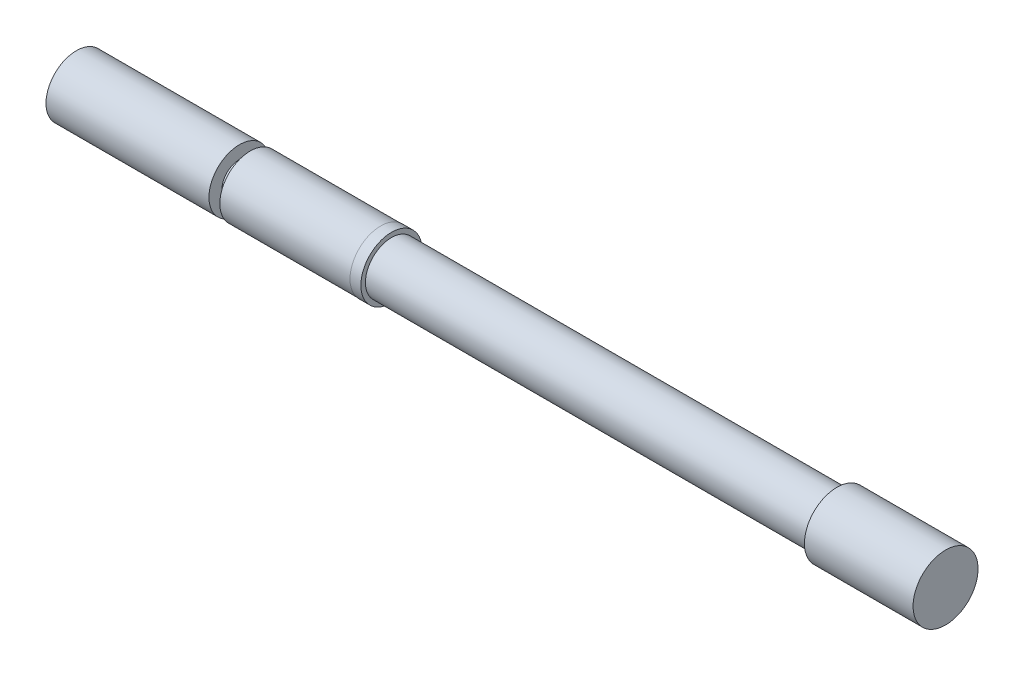
ISO-10303-21;
HEADER;
FILE_DESCRIPTION(('STEP AP214'),'2;1');
FILE_NAME('part.step','',(''),(''),'','','');
FILE_SCHEMA(('AUTOMOTIVE_DESIGN { 1 0 10303 214 1 1 1 1 }'));
ENDSEC;
DATA;
#1=APPLICATION_CONTEXT('core data for automotive mechanical design processes');
#2=APPLICATION_PROTOCOL_DEFINITION('international standard','automotive_design',2000,#1);
#3=PRODUCT_CONTEXT('',#1,'mechanical');
#4=PRODUCT('Part','Part','',(#3));
#5=PRODUCT_RELATED_PRODUCT_CATEGORY('part','',(#4));
#6=PRODUCT_DEFINITION_FORMATION('','',#4);
#7=PRODUCT_DEFINITION_CONTEXT('part definition',#1,'design');
#8=PRODUCT_DEFINITION('design','',#6,#7);
#9=PRODUCT_DEFINITION_SHAPE('','',#8);
#10=(LENGTH_UNIT() NAMED_UNIT(*) SI_UNIT(.MILLI.,.METRE.));
#11=(NAMED_UNIT(*) PLANE_ANGLE_UNIT() SI_UNIT($,.RADIAN.));
#12=(NAMED_UNIT(*) SI_UNIT($,.STERADIAN.) SOLID_ANGLE_UNIT());
#13=UNCERTAINTY_MEASURE_WITH_UNIT(LENGTH_MEASURE(1.E-05),#10,'distance_accuracy_value','');
#14=(GEOMETRIC_REPRESENTATION_CONTEXT(3) GLOBAL_UNCERTAINTY_ASSIGNED_CONTEXT((#13)) GLOBAL_UNIT_ASSIGNED_CONTEXT((#10,
#11,#12)) REPRESENTATION_CONTEXT('',''));
#15=CARTESIAN_POINT('',(0.,0.,0.));
#16=DIRECTION('',(0.,0.,1.));
#17=DIRECTION('',(1.,0.,0.));
#18=AXIS2_PLACEMENT_3D('',#15,#16,#17);
#19=CARTESIAN_POINT('',(0.,0.,0.));
#20=DIRECTION('',(1.,0.,0.));
#21=DIRECTION('',(0.,0.,-1.));
#22=AXIS2_PLACEMENT_3D('',#19,#20,#21);
#23=PLANE('',#22);
#24=CARTESIAN_POINT('',(0.,0.,0.));
#25=DIRECTION('',(-1.,0.,0.));
#26=DIRECTION('',(0.,0.,1.));
#27=AXIS2_PLACEMENT_3D('',#24,#25,#26);
#28=CIRCLE('',#27,14.);
#29=CARTESIAN_POINT('',(0.,0.,14.));
#30=VERTEX_POINT('',#29);
#31=EDGE_CURVE('E10',#30,#30,#28,.T.);
#32=ORIENTED_EDGE('',*,*,#31,.T.);
#33=EDGE_LOOP('',(#32));
#34=FACE_BOUND('',#33,.T.);
#35=ADVANCED_FACE('F37',(#34),#23,.F.);
#36=CARTESIAN_POINT('',(0.,0.,0.));
#37=DIRECTION('',(-1.,0.,0.));
#38=DIRECTION('',(0.,0.,1.));
#39=AXIS2_PLACEMENT_3D('',#36,#37,#38);
#40=CYLINDRICAL_SURFACE('',#39,14.);
#41=ORIENTED_EDGE('',*,*,#31,.F.);
#42=EDGE_LOOP('',(#41));
#43=FACE_BOUND('',#42,.T.);
#44=CARTESIAN_POINT('',(75.,0.,0.));
#45=DIRECTION('',(-1.,0.,0.));
#46=DIRECTION('',(0.,0.,1.));
#47=AXIS2_PLACEMENT_3D('',#44,#45,#46);
#48=CIRCLE('',#47,14.);
#49=CARTESIAN_POINT('',(75.,0.,14.));
#50=VERTEX_POINT('',#49);
#51=EDGE_CURVE('E44',#50,#50,#48,.T.);
#52=ORIENTED_EDGE('',*,*,#51,.T.);
#53=EDGE_LOOP('',(#52));
#54=FACE_BOUND('',#53,.T.);
#55=ADVANCED_FACE('F105',(#43,#54),#40,.T.);
#56=CARTESIAN_POINT('',(75.,14.,0.));
#57=DIRECTION('',(-1.,0.,0.));
#58=DIRECTION('',(0.,0.,1.));
#59=AXIS2_PLACEMENT_3D('',#56,#57,#58);
#60=PLANE('',#59);
#61=ORIENTED_EDGE('',*,*,#51,.F.);
#62=EDGE_LOOP('',(#61));
#63=FACE_BOUND('',#62,.T.);
#64=CARTESIAN_POINT('',(75.,0.,0.));
#65=DIRECTION('',(-1.,0.,0.));
#66=DIRECTION('',(0.,0.,1.));
#67=AXIS2_PLACEMENT_3D('',#64,#65,#66);
#68=CIRCLE('',#67,8.08666508621472);
#69=CARTESIAN_POINT('',(75.,0.,8.08666508621472));
#70=VERTEX_POINT('',#69);
#71=EDGE_CURVE('E49',#70,#70,#68,.T.);
#72=ORIENTED_EDGE('',*,*,#71,.T.);
#73=EDGE_LOOP('',(#72));
#74=FACE_BOUND('',#73,.T.);
#75=ADVANCED_FACE('F109',(#63,#74),#60,.F.);
#76=CARTESIAN_POINT('',(0.,0.,0.));
#77=DIRECTION('',(-1.,0.,0.));
#78=DIRECTION('',(0.,0.,1.));
#79=AXIS2_PLACEMENT_3D('',#76,#77,#78);
#80=CYLINDRICAL_SURFACE('',#79,8.08666508621472);
#81=ORIENTED_EDGE('',*,*,#71,.F.);
#82=EDGE_LOOP('',(#81));
#83=FACE_BOUND('',#82,.T.);
#84=CARTESIAN_POINT('',(80.,0.,0.));
#85=DIRECTION('',(-1.,0.,0.));
#86=DIRECTION('',(0.,0.,1.));
#87=AXIS2_PLACEMENT_3D('',#84,#85,#86);
#88=CIRCLE('',#87,8.08666508621472);
#89=CARTESIAN_POINT('',(80.,0.,8.08666508621472));
#90=VERTEX_POINT('',#89);
#91=EDGE_CURVE('E54',#90,#90,#88,.T.);
#92=ORIENTED_EDGE('',*,*,#91,.T.);
#93=EDGE_LOOP('',(#92));
#94=FACE_BOUND('',#93,.T.);
#95=ADVANCED_FACE('F114',(#83,#94),#80,.T.);
#96=CARTESIAN_POINT('',(80.,8.08666508621472,0.));
#97=DIRECTION('',(1.,0.,0.));
#98=DIRECTION('',(0.,0.,-1.));
#99=AXIS2_PLACEMENT_3D('',#96,#97,#98);
#100=PLANE('',#99);
#101=ORIENTED_EDGE('',*,*,#91,.F.);
#102=EDGE_LOOP('',(#101));
#103=FACE_BOUND('',#102,.T.);
#104=CARTESIAN_POINT('',(80.,0.,0.));
#105=DIRECTION('',(-1.,0.,0.));
#106=DIRECTION('',(0.,0.,1.));
#107=AXIS2_PLACEMENT_3D('',#104,#105,#106);
#108=CIRCLE('',#107,14.);
#109=CARTESIAN_POINT('',(80.,0.,14.));
#110=VERTEX_POINT('',#109);
#111=EDGE_CURVE('E60',#110,#110,#108,.T.);
#112=ORIENTED_EDGE('',*,*,#111,.T.);
#113=EDGE_LOOP('',(#112));
#114=FACE_BOUND('',#113,.T.);
#115=ADVANCED_FACE('F120',(#103,#114),#100,.F.);
#116=CARTESIAN_POINT('',(0.,0.,0.));
#117=DIRECTION('',(-1.,0.,0.));
#118=DIRECTION('',(0.,0.,1.));
#119=AXIS2_PLACEMENT_3D('',#116,#117,#118);
#120=CYLINDRICAL_SURFACE('',#119,14.);
#121=ORIENTED_EDGE('',*,*,#111,.F.);
#122=EDGE_LOOP('',(#121));
#123=FACE_BOUND('',#122,.T.);
#124=CARTESIAN_POINT('',(140.,0.,0.));
#125=DIRECTION('',(-1.,0.,0.));
#126=DIRECTION('',(0.,0.,1.));
#127=AXIS2_PLACEMENT_3D('',#124,#125,#126);
#128=CIRCLE('',#127,14.);
#129=CARTESIAN_POINT('',(140.,0.,14.));
#130=VERTEX_POINT('',#129);
#131=EDGE_CURVE('E64',#130,#130,#128,.T.);
#132=ORIENTED_EDGE('',*,*,#131,.T.);
#133=EDGE_LOOP('',(#132));
#134=FACE_BOUND('',#133,.T.);
#135=ADVANCED_FACE('F124',(#123,#134),#120,.T.);
#136=CARTESIAN_POINT('',(140.,14.,0.));
#137=DIRECTION('',(1.,0.,0.));
#138=DIRECTION('',(0.,0.,-1.));
#139=AXIS2_PLACEMENT_3D('',#136,#137,#138);
#140=PLANE('',#139);
#141=ORIENTED_EDGE('',*,*,#131,.F.);
#142=EDGE_LOOP('',(#141));
#143=FACE_BOUND('',#142,.T.);
#144=CARTESIAN_POINT('',(140.,0.,0.));
#145=DIRECTION('',(-1.,0.,0.));
#146=DIRECTION('',(0.,0.,1.));
#147=AXIS2_PLACEMENT_3D('',#144,#145,#146);
#148=CIRCLE('',#147,14.094661294728);
#149=CARTESIAN_POINT('',(140.,0.,14.094661294728));
#150=VERTEX_POINT('',#149);
#151=EDGE_CURVE('E68',#150,#150,#148,.T.);
#152=ORIENTED_EDGE('',*,*,#151,.T.);
#153=EDGE_LOOP('',(#152));
#154=FACE_BOUND('',#153,.T.);
#155=ADVANCED_FACE('F128',(#143,#154),#140,.F.);
#156=CARTESIAN_POINT('',(0.,0.,0.));
#157=DIRECTION('',(-1.,0.,0.));
#158=DIRECTION('',(0.,0.,1.));
#159=AXIS2_PLACEMENT_3D('',#156,#157,#158);
#160=CYLINDRICAL_SURFACE('',#159,14.094661294728);
#161=ORIENTED_EDGE('',*,*,#151,.F.);
#162=EDGE_LOOP('',(#161));
#163=FACE_BOUND('',#162,.T.);
#164=CARTESIAN_POINT('',(145.,0.,0.));
#165=DIRECTION('',(-1.,0.,0.));
#166=DIRECTION('',(0.,0.,1.));
#167=AXIS2_PLACEMENT_3D('',#164,#165,#166);
#168=CIRCLE('',#167,14.094661294728);
#169=CARTESIAN_POINT('',(145.,0.,14.094661294728));
#170=VERTEX_POINT('',#169);
#171=EDGE_CURVE('E72',#170,#170,#168,.T.);
#172=ORIENTED_EDGE('',*,*,#171,.T.);
#173=EDGE_LOOP('',(#172));
#174=FACE_BOUND('',#173,.T.);
#175=ADVANCED_FACE('F132',(#163,#174),#160,.T.);
#176=CARTESIAN_POINT('',(145.,14.094661294728,0.));
#177=DIRECTION('',(-1.,0.,0.));
#178=DIRECTION('',(0.,0.,1.));
#179=AXIS2_PLACEMENT_3D('',#176,#177,#178);
#180=PLANE('',#179);
#181=ORIENTED_EDGE('',*,*,#171,.F.);
#182=EDGE_LOOP('',(#181));
#183=FACE_BOUND('',#182,.T.);
#184=CARTESIAN_POINT('',(145.,0.,0.));
#185=DIRECTION('',(-1.,0.,0.));
#186=DIRECTION('',(0.,0.,1.));
#187=AXIS2_PLACEMENT_3D('',#184,#185,#186);
#188=CIRCLE('',#187,12.);
#189=CARTESIAN_POINT('',(145.,0.,12.));
#190=VERTEX_POINT('',#189);
#191=EDGE_CURVE('E76',#190,#190,#188,.T.);
#192=ORIENTED_EDGE('',*,*,#191,.T.);
#193=EDGE_LOOP('',(#192));
#194=FACE_BOUND('',#193,.T.);
#195=ADVANCED_FACE('F136',(#183,#194),#180,.F.);
#196=CARTESIAN_POINT('',(0.,0.,0.));
#197=DIRECTION('',(-1.,0.,0.));
#198=DIRECTION('',(0.,0.,1.));
#199=AXIS2_PLACEMENT_3D('',#196,#197,#198);
#200=CYLINDRICAL_SURFACE('',#199,12.);
#201=ORIENTED_EDGE('',*,*,#191,.F.);
#202=EDGE_LOOP('',(#201));
#203=FACE_BOUND('',#202,.T.);
#204=CARTESIAN_POINT('',(350.,0.,0.));
#205=DIRECTION('',(-1.,0.,0.));
#206=DIRECTION('',(0.,0.,1.));
#207=AXIS2_PLACEMENT_3D('',#204,#205,#206);
#208=CIRCLE('',#207,12.);
#209=CARTESIAN_POINT('',(350.,0.,12.));
#210=VERTEX_POINT('',#209);
#211=EDGE_CURVE('E80',#210,#210,#208,.T.);
#212=ORIENTED_EDGE('',*,*,#211,.T.);
#213=EDGE_LOOP('',(#212));
#214=FACE_BOUND('',#213,.T.);
#215=ADVANCED_FACE('F140',(#203,#214),#200,.T.);
#216=CARTESIAN_POINT('',(350.,12.,0.));
#217=DIRECTION('',(1.,0.,0.));
#218=DIRECTION('',(0.,0.,-1.));
#219=AXIS2_PLACEMENT_3D('',#216,#217,#218);
#220=PLANE('',#219);
#221=ORIENTED_EDGE('',*,*,#211,.F.);
#222=EDGE_LOOP('',(#221));
#223=FACE_BOUND('',#222,.T.);
#224=CARTESIAN_POINT('',(350.,0.,0.));
#225=DIRECTION('',(-1.,0.,0.));
#226=DIRECTION('',(0.,0.,1.));
#227=AXIS2_PLACEMENT_3D('',#224,#225,#226);
#228=CIRCLE('',#227,14.9566674568927);
#229=CARTESIAN_POINT('',(350.,0.,14.9566674568927));
#230=VERTEX_POINT('',#229);
#231=EDGE_CURVE('E84',#230,#230,#228,.T.);
#232=ORIENTED_EDGE('',*,*,#231,.T.);
#233=EDGE_LOOP('',(#232));
#234=FACE_BOUND('',#233,.T.);
#235=ADVANCED_FACE('F101',(#223,#234),#220,.F.);
#236=CARTESIAN_POINT('',(0.,0.,0.));
#237=DIRECTION('',(-1.,0.,0.));
#238=DIRECTION('',(0.,0.,1.));
#239=AXIS2_PLACEMENT_3D('',#236,#237,#238);
#240=CYLINDRICAL_SURFACE('',#239,14.9566674568927);
#241=ORIENTED_EDGE('',*,*,#231,.F.);
#242=EDGE_LOOP('',(#241));
#243=FACE_BOUND('',#242,.T.);
#244=CARTESIAN_POINT('',(400.,0.,0.));
#245=DIRECTION('',(-1.,0.,0.));
#246=DIRECTION('',(0.,0.,1.));
#247=AXIS2_PLACEMENT_3D('',#244,#245,#246);
#248=CIRCLE('',#247,14.9566674568926);
#249=CARTESIAN_POINT('',(400.,0.,14.9566674568926));
#250=VERTEX_POINT('',#249);
#251=EDGE_CURVE('E88',#250,#250,#248,.T.);
#252=ORIENTED_EDGE('',*,*,#251,.T.);
#253=EDGE_LOOP('',(#252));
#254=FACE_BOUND('',#253,.T.);
#255=ADVANCED_FACE('F93',(#243,#254),#240,.T.);
#256=CARTESIAN_POINT('',(400.,14.9566674568926,0.));
#257=DIRECTION('',(-1.,0.,0.));
#258=DIRECTION('',(0.,0.,1.));
#259=AXIS2_PLACEMENT_3D('',#256,#257,#258);
#260=PLANE('',#259);
#261=ORIENTED_EDGE('',*,*,#251,.F.);
#262=EDGE_LOOP('',(#261));
#263=FACE_BOUND('',#262,.T.);
#264=ADVANCED_FACE('F95',(#263),#260,.F.);
#265=CLOSED_SHELL('',(#35,#55,#75,#95,#115,#135,#155,#175,#195,#215,#235,#255,#264));
#266=MANIFOLD_SOLID_BREP('B2',#265);
#267=ADVANCED_BREP_SHAPE_REPRESENTATION('',(#18,#266),#14);
#268=SHAPE_DEFINITION_REPRESENTATION(#9,#267);
ENDSEC;
END-ISO-10303-21;
